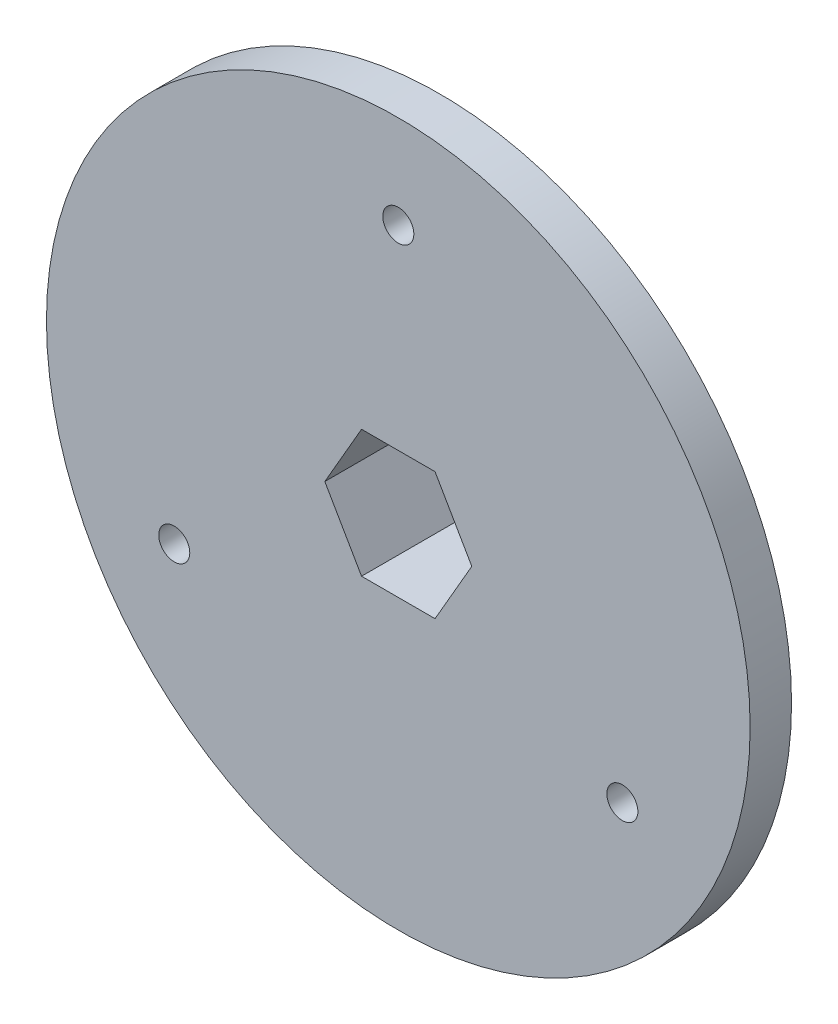
ISO-10303-21;
HEADER;
FILE_DESCRIPTION(('STEP AP214'),'2;1');
FILE_NAME('part.step','',(''),(''),'','','');
FILE_SCHEMA(('AUTOMOTIVE_DESIGN { 1 0 10303 214 1 1 1 1 }'));
ENDSEC;
DATA;
#1=APPLICATION_CONTEXT('core data for automotive mechanical design processes');
#2=APPLICATION_PROTOCOL_DEFINITION('international standard','automotive_design',2000,#1);
#3=PRODUCT_CONTEXT('',#1,'mechanical');
#4=PRODUCT('Part','Part','',(#3));
#5=PRODUCT_RELATED_PRODUCT_CATEGORY('part','',(#4));
#6=PRODUCT_DEFINITION_FORMATION('','',#4);
#7=PRODUCT_DEFINITION_CONTEXT('part definition',#1,'design');
#8=PRODUCT_DEFINITION('design','',#6,#7);
#9=PRODUCT_DEFINITION_SHAPE('','',#8);
#10=(LENGTH_UNIT() NAMED_UNIT(*) SI_UNIT(.MILLI.,.METRE.));
#11=(NAMED_UNIT(*) PLANE_ANGLE_UNIT() SI_UNIT($,.RADIAN.));
#12=(NAMED_UNIT(*) SI_UNIT($,.STERADIAN.) SOLID_ANGLE_UNIT());
#13=UNCERTAINTY_MEASURE_WITH_UNIT(LENGTH_MEASURE(1.E-05),#10,'distance_accuracy_value','');
#14=(GEOMETRIC_REPRESENTATION_CONTEXT(3) GLOBAL_UNCERTAINTY_ASSIGNED_CONTEXT((#13)) GLOBAL_UNIT_ASSIGNED_CONTEXT((#10,
#11,#12)) REPRESENTATION_CONTEXT('',''));
#15=CARTESIAN_POINT('',(0.,0.,0.));
#16=DIRECTION('',(0.,0.,1.));
#17=DIRECTION('',(1.,0.,0.));
#18=AXIS2_PLACEMENT_3D('',#15,#16,#17);
#19=CARTESIAN_POINT('',(0.,0.,0.));
#20=DIRECTION('',(0.,0.,1.));
#21=DIRECTION('',(1.,0.,0.));
#22=AXIS2_PLACEMENT_3D('',#19,#20,#21);
#23=PLANE('',#22);
#24=CARTESIAN_POINT('',(-21.650635094611,-12.5,0.));
#25=DIRECTION('',(0.,0.,1.));
#26=DIRECTION('',(1.,0.,0.));
#27=AXIS2_PLACEMENT_3D('',#24,#25,#26);
#28=CIRCLE('',#27,1.5);
#29=CARTESIAN_POINT('',(-20.150635094611,-12.5,0.));
#30=VERTEX_POINT('',#29);
#31=EDGE_CURVE('E162',#30,#30,#28,.T.);
#32=ORIENTED_EDGE('',*,*,#31,.T.);
#33=EDGE_LOOP('',(#32));
#34=FACE_BOUND('',#33,.T.);
#35=CARTESIAN_POINT('',(21.650635094611,-12.5,0.));
#36=DIRECTION('',(0.,0.,1.));
#37=DIRECTION('',(1.,0.,0.));
#38=AXIS2_PLACEMENT_3D('',#35,#36,#37);
#39=CIRCLE('',#38,1.50000000000004);
#40=CARTESIAN_POINT('',(23.150635094611,-12.5,0.));
#41=VERTEX_POINT('',#40);
#42=EDGE_CURVE('E177',#41,#41,#39,.T.);
#43=ORIENTED_EDGE('',*,*,#42,.T.);
#44=EDGE_LOOP('',(#43));
#45=FACE_BOUND('',#44,.T.);
#46=CARTESIAN_POINT('',(0.,25.,0.));
#47=DIRECTION('',(0.,0.,1.));
#48=DIRECTION('',(1.,0.,0.));
#49=AXIS2_PLACEMENT_3D('',#46,#47,#48);
#50=CIRCLE('',#49,1.5);
#51=CARTESIAN_POINT('',(1.5,25.,0.));
#52=VERTEX_POINT('',#51);
#53=EDGE_CURVE('E185',#52,#52,#50,.T.);
#54=ORIENTED_EDGE('',*,*,#53,.T.);
#55=EDGE_LOOP('',(#54));
#56=FACE_BOUND('',#55,.T.);
#57=CARTESIAN_POINT('',(0.,0.,0.));
#58=DIRECTION('',(0.,0.,1.));
#59=DIRECTION('',(1.,0.,0.));
#60=AXIS2_PLACEMENT_3D('',#57,#58,#59);
#61=CIRCLE('',#60,34.);
#62=CARTESIAN_POINT('',(34.,0.,0.));
#63=VERTEX_POINT('',#62);
#64=EDGE_CURVE('E193',#63,#63,#61,.T.);
#65=ORIENTED_EDGE('',*,*,#64,.F.);
#66=EDGE_LOOP('',(#65));
#67=FACE_BOUND('',#66,.T.);
#68=CARTESIAN_POINT('',(0.,0.,0.));
#69=DIRECTION('',(0.,0.,1.));
#70=DIRECTION('',(1.,0.,0.));
#71=AXIS2_PLACEMENT_3D('',#68,#69,#70);
#72=CIRCLE('',#71,16.9622689297226);
#73=CARTESIAN_POINT('',(16.9622689297226,0.,0.));
#74=VERTEX_POINT('',#73);
#75=EDGE_CURVE('E11',#74,#74,#72,.F.);
#76=ORIENTED_EDGE('',*,*,#75,.F.);
#77=EDGE_LOOP('',(#76));
#78=FACE_BOUND('',#77,.T.);
#79=ADVANCED_FACE('F41',(#34,#45,#56,#67,#78),#23,.F.);
#80=CARTESIAN_POINT('',(0.,0.,4.));
#81=DIRECTION('',(0.,0.,1.));
#82=DIRECTION('',(1.,0.,0.));
#83=AXIS2_PLACEMENT_3D('',#80,#81,#82);
#84=PLANE('',#83);
#85=DIRECTION('',(0.5,0.866025403784438,0.));
#86=VECTOR('',#85,1.);
#87=CARTESIAN_POINT('',(-7.1014083110324,0.,4.));
#88=LINE('',#87,#86);
#89=CARTESIAN_POINT('',(-7.1014083110324,0.,4.));
#90=VERTEX_POINT('',#89);
#91=CARTESIAN_POINT('',(-3.5507041555162,6.15,4.));
#92=VERTEX_POINT('',#91);
#93=EDGE_CURVE('E139',#90,#92,#88,.T.);
#94=ORIENTED_EDGE('',*,*,#93,.T.);
#95=DIRECTION('',(1.,0.,0.));
#96=VECTOR('',#95,1.);
#97=CARTESIAN_POINT('',(-3.5507041555162,6.15,4.));
#98=LINE('',#97,#96);
#99=CARTESIAN_POINT('',(3.5507041555162,6.15,4.));
#100=VERTEX_POINT('',#99);
#101=EDGE_CURVE('E143',#92,#100,#98,.T.);
#102=ORIENTED_EDGE('',*,*,#101,.T.);
#103=DIRECTION('',(0.5,-0.866025403784439,0.));
#104=VECTOR('',#103,1.);
#105=CARTESIAN_POINT('',(3.5507041555162,6.15,4.));
#106=LINE('',#105,#104);
#107=CARTESIAN_POINT('',(7.1014083110324,0.,4.));
#108=VERTEX_POINT('',#107);
#109=EDGE_CURVE('E57',#100,#108,#106,.T.);
#110=ORIENTED_EDGE('',*,*,#109,.T.);
#111=DIRECTION('',(-0.5,-0.866025403784438,0.));
#112=VECTOR('',#111,1.);
#113=CARTESIAN_POINT('',(7.1014083110324,0.,4.));
#114=LINE('',#113,#112);
#115=CARTESIAN_POINT('',(3.5507041555162,-6.15,4.));
#116=VERTEX_POINT('',#115);
#117=EDGE_CURVE('E148',#108,#116,#114,.T.);
#118=ORIENTED_EDGE('',*,*,#117,.T.);
#119=DIRECTION('',(-1.,0.,0.));
#120=VECTOR('',#119,1.);
#121=CARTESIAN_POINT('',(3.5507041555162,-6.15,4.));
#122=LINE('',#121,#120);
#123=CARTESIAN_POINT('',(-3.5507041555162,-6.15,4.));
#124=VERTEX_POINT('',#123);
#125=EDGE_CURVE('E152',#116,#124,#122,.T.);
#126=ORIENTED_EDGE('',*,*,#125,.T.);
#127=DIRECTION('',(-0.5,0.866025403784439,0.));
#128=VECTOR('',#127,1.);
#129=CARTESIAN_POINT('',(-3.5507041555162,-6.15,4.));
#130=LINE('',#129,#128);
#131=EDGE_CURVE('E156',#124,#90,#130,.T.);
#132=ORIENTED_EDGE('',*,*,#131,.T.);
#133=EDGE_LOOP('',(#94,#102,#110,#118,#126,#132));
#134=FACE_BOUND('',#133,.T.);
#135=CARTESIAN_POINT('',(21.650635094611,-12.5,4.));
#136=DIRECTION('',(0.,0.,1.));
#137=DIRECTION('',(1.,0.,0.));
#138=AXIS2_PLACEMENT_3D('',#135,#136,#137);
#139=CIRCLE('',#138,1.50000000000004);
#140=CARTESIAN_POINT('',(23.150635094611,-12.5,4.));
#141=VERTEX_POINT('',#140);
#142=EDGE_CURVE('E181',#141,#141,#139,.T.);
#143=ORIENTED_EDGE('',*,*,#142,.F.);
#144=EDGE_LOOP('',(#143));
#145=FACE_BOUND('',#144,.T.);
#146=CARTESIAN_POINT('',(0.,0.,4.));
#147=DIRECTION('',(0.,0.,1.));
#148=DIRECTION('',(1.,0.,0.));
#149=AXIS2_PLACEMENT_3D('',#146,#147,#148);
#150=CIRCLE('',#149,34.);
#151=CARTESIAN_POINT('',(34.,0.,4.));
#152=VERTEX_POINT('',#151);
#153=EDGE_CURVE('E50',#152,#152,#150,.T.);
#154=ORIENTED_EDGE('',*,*,#153,.T.);
#155=EDGE_LOOP('',(#154));
#156=FACE_BOUND('',#155,.T.);
#157=CARTESIAN_POINT('',(0.,25.,4.));
#158=DIRECTION('',(0.,0.,1.));
#159=DIRECTION('',(1.,0.,0.));
#160=AXIS2_PLACEMENT_3D('',#157,#158,#159);
#161=CIRCLE('',#160,1.5);
#162=CARTESIAN_POINT('',(1.5,25.,4.));
#163=VERTEX_POINT('',#162);
#164=EDGE_CURVE('E189',#163,#163,#161,.T.);
#165=ORIENTED_EDGE('',*,*,#164,.F.);
#166=EDGE_LOOP('',(#165));
#167=FACE_BOUND('',#166,.T.);
#168=CARTESIAN_POINT('',(-21.650635094611,-12.5,4.));
#169=DIRECTION('',(0.,0.,1.));
#170=DIRECTION('',(1.,0.,0.));
#171=AXIS2_PLACEMENT_3D('',#168,#169,#170);
#172=CIRCLE('',#171,1.5);
#173=CARTESIAN_POINT('',(-20.150635094611,-12.5,4.));
#174=VERTEX_POINT('',#173);
#175=EDGE_CURVE('E173',#174,#174,#172,.T.);
#176=ORIENTED_EDGE('',*,*,#175,.F.);
#177=EDGE_LOOP('',(#176));
#178=FACE_BOUND('',#177,.T.);
#179=ADVANCED_FACE('F206',(#134,#145,#156,#167,#178),#84,.T.);
#180=CARTESIAN_POINT('',(0.,0.,4.));
#181=DIRECTION('',(0.,0.,-1.));
#182=DIRECTION('',(-1.,0.,0.));
#183=AXIS2_PLACEMENT_3D('',#180,#181,#182);
#184=CYLINDRICAL_SURFACE('',#183,34.);
#185=ORIENTED_EDGE('',*,*,#153,.F.);
#186=EDGE_LOOP('',(#185));
#187=FACE_BOUND('',#186,.T.);
#188=ORIENTED_EDGE('',*,*,#64,.T.);
#189=EDGE_LOOP('',(#188));
#190=FACE_BOUND('',#189,.T.);
#191=ADVANCED_FACE('F43',(#187,#190),#184,.T.);
#192=CARTESIAN_POINT('',(0.,25.,4.));
#193=DIRECTION('',(0.,0.,-1.));
#194=DIRECTION('',(-1.,0.,0.));
#195=AXIS2_PLACEMENT_3D('',#192,#193,#194);
#196=CYLINDRICAL_SURFACE('',#195,1.5);
#197=ORIENTED_EDGE('',*,*,#164,.T.);
#198=EDGE_LOOP('',(#197));
#199=FACE_BOUND('',#198,.T.);
#200=ORIENTED_EDGE('',*,*,#53,.F.);
#201=EDGE_LOOP('',(#200));
#202=FACE_BOUND('',#201,.T.);
#203=ADVANCED_FACE('F246',(#199,#202),#196,.F.);
#204=CARTESIAN_POINT('',(21.650635094611,-12.5,4.));
#205=DIRECTION('',(0.,0.,-1.));
#206=DIRECTION('',(-1.,0.,0.));
#207=AXIS2_PLACEMENT_3D('',#204,#205,#206);
#208=CYLINDRICAL_SURFACE('',#207,1.50000000000004);
#209=ORIENTED_EDGE('',*,*,#142,.T.);
#210=EDGE_LOOP('',(#209));
#211=FACE_BOUND('',#210,.T.);
#212=ORIENTED_EDGE('',*,*,#42,.F.);
#213=EDGE_LOOP('',(#212));
#214=FACE_BOUND('',#213,.T.);
#215=ADVANCED_FACE('F242',(#211,#214),#208,.F.);
#216=CARTESIAN_POINT('',(-21.650635094611,-12.5,4.));
#217=DIRECTION('',(0.,0.,-1.));
#218=DIRECTION('',(-1.,0.,0.));
#219=AXIS2_PLACEMENT_3D('',#216,#217,#218);
#220=CYLINDRICAL_SURFACE('',#219,1.5);
#221=ORIENTED_EDGE('',*,*,#175,.T.);
#222=EDGE_LOOP('',(#221));
#223=FACE_BOUND('',#222,.T.);
#224=ORIENTED_EDGE('',*,*,#31,.F.);
#225=EDGE_LOOP('',(#224));
#226=FACE_BOUND('',#225,.T.);
#227=ADVANCED_FACE('F238',(#223,#226),#220,.F.);
#228=CARTESIAN_POINT('',(-7.1014083110324,0.,4.));
#229=DIRECTION('',(-0.866025403784439,0.5,0.));
#230=DIRECTION('',(-0.5,-0.866025403784438,0.));
#231=AXIS2_PLACEMENT_3D('',#228,#229,#230);
#232=PLANE('',#231);
#233=DIRECTION('',(0.,0.,-1.));
#234=VECTOR('',#233,1.);
#235=CARTESIAN_POINT('',(-7.1014083110324,0.,4.));
#236=LINE('',#235,#234);
#237=CARTESIAN_POINT('',(-7.1014083110324,0.,-6.));
#238=VERTEX_POINT('',#237);
#239=EDGE_CURVE('E65',#90,#238,#236,.T.);
#240=ORIENTED_EDGE('',*,*,#239,.T.);
#241=DIRECTION('',(-0.5,-0.866025403784439,0.));
#242=VECTOR('',#241,1.);
#243=CARTESIAN_POINT('',(-5.3260562332743,3.075,-6.));
#244=LINE('',#243,#242);
#245=CARTESIAN_POINT('',(-3.5507041555162,6.15,-6.));
#246=VERTEX_POINT('',#245);
#247=EDGE_CURVE('E113',#246,#238,#244,.T.);
#248=ORIENTED_EDGE('',*,*,#247,.F.);
#249=DIRECTION('',(0.,0.,-1.));
#250=VECTOR('',#249,1.);
#251=CARTESIAN_POINT('',(-3.5507041555162,6.15,4.));
#252=LINE('',#251,#250);
#253=EDGE_CURVE('E104',#92,#246,#252,.T.);
#254=ORIENTED_EDGE('',*,*,#253,.F.);
#255=ORIENTED_EDGE('',*,*,#93,.F.);
#256=EDGE_LOOP('',(#240,#248,#254,#255));
#257=FACE_BOUND('',#256,.T.);
#258=ADVANCED_FACE('F224',(#257),#232,.F.);
#259=CARTESIAN_POINT('',(-3.5507041555162,-6.15,4.));
#260=DIRECTION('',(-0.866025403784439,-0.5,0.));
#261=DIRECTION('',(0.5,-0.866025403784439,0.));
#262=AXIS2_PLACEMENT_3D('',#259,#260,#261);
#263=PLANE('',#262);
#264=DIRECTION('',(0.,0.,-1.));
#265=VECTOR('',#264,1.);
#266=CARTESIAN_POINT('',(-3.5507041555162,-6.15,4.));
#267=LINE('',#266,#265);
#268=CARTESIAN_POINT('',(-3.5507041555162,-6.15,-6.));
#269=VERTEX_POINT('',#268);
#270=EDGE_CURVE('E163',#124,#269,#267,.T.);
#271=ORIENTED_EDGE('',*,*,#270,.T.);
#272=DIRECTION('',(0.5,-0.866025403784439,0.));
#273=VECTOR('',#272,1.);
#274=CARTESIAN_POINT('',(-5.3260562332743,-3.075,-6.));
#275=LINE('',#274,#273);
#276=EDGE_CURVE('E130',#238,#269,#275,.T.);
#277=ORIENTED_EDGE('',*,*,#276,.F.);
#278=ORIENTED_EDGE('',*,*,#239,.F.);
#279=ORIENTED_EDGE('',*,*,#131,.F.);
#280=EDGE_LOOP('',(#271,#277,#278,#279));
#281=FACE_BOUND('',#280,.T.);
#282=ADVANCED_FACE('F220',(#281),#263,.F.);
#283=CARTESIAN_POINT('',(3.5507041555162,-6.15,4.));
#284=DIRECTION('',(0.,-1.,0.));
#285=DIRECTION('',(0.,0.,-1.));
#286=AXIS2_PLACEMENT_3D('',#283,#284,#285);
#287=PLANE('',#286);
#288=DIRECTION('',(0.,0.,-1.));
#289=VECTOR('',#288,1.);
#290=CARTESIAN_POINT('',(3.5507041555162,-6.15,4.));
#291=LINE('',#290,#289);
#292=CARTESIAN_POINT('',(3.5507041555162,-6.15,-6.));
#293=VERTEX_POINT('',#292);
#294=EDGE_CURVE('E166',#116,#293,#291,.T.);
#295=ORIENTED_EDGE('',*,*,#294,.T.);
#296=DIRECTION('',(1.,0.,0.));
#297=VECTOR('',#296,1.);
#298=CARTESIAN_POINT('',(0.,-6.15,-6.));
#299=LINE('',#298,#297);
#300=EDGE_CURVE('E134',#269,#293,#299,.T.);
#301=ORIENTED_EDGE('',*,*,#300,.F.);
#302=ORIENTED_EDGE('',*,*,#270,.F.);
#303=ORIENTED_EDGE('',*,*,#125,.F.);
#304=EDGE_LOOP('',(#295,#301,#302,#303));
#305=FACE_BOUND('',#304,.T.);
#306=ADVANCED_FACE('F223',(#305),#287,.F.);
#307=CARTESIAN_POINT('',(7.1014083110324,0.,4.));
#308=DIRECTION('',(0.866025403784438,-0.5,0.));
#309=DIRECTION('',(0.5,0.866025403784439,0.));
#310=AXIS2_PLACEMENT_3D('',#307,#308,#309);
#311=PLANE('',#310);
#312=DIRECTION('',(0.,0.,-1.));
#313=VECTOR('',#312,1.);
#314=CARTESIAN_POINT('',(7.1014083110324,0.,4.));
#315=LINE('',#314,#313);
#316=CARTESIAN_POINT('',(7.1014083110324,0.,-6.));
#317=VERTEX_POINT('',#316);
#318=EDGE_CURVE('E103',#108,#317,#315,.T.);
#319=ORIENTED_EDGE('',*,*,#318,.T.);
#320=DIRECTION('',(0.5,0.866025403784439,0.));
#321=VECTOR('',#320,1.);
#322=CARTESIAN_POINT('',(5.3260562332743,-3.075,-6.));
#323=LINE('',#322,#321);
#324=EDGE_CURVE('E120',#293,#317,#323,.T.);
#325=ORIENTED_EDGE('',*,*,#324,.F.);
#326=ORIENTED_EDGE('',*,*,#294,.F.);
#327=ORIENTED_EDGE('',*,*,#117,.F.);
#328=EDGE_LOOP('',(#319,#325,#326,#327));
#329=FACE_BOUND('',#328,.T.);
#330=ADVANCED_FACE('F227',(#329),#311,.F.);
#331=CARTESIAN_POINT('',(3.5507041555162,6.15,4.));
#332=DIRECTION('',(0.866025403784439,0.5,0.));
#333=DIRECTION('',(-0.5,0.866025403784439,0.));
#334=AXIS2_PLACEMENT_3D('',#331,#332,#333);
#335=PLANE('',#334);
#336=DIRECTION('',(0.,0.,-1.));
#337=VECTOR('',#336,1.);
#338=CARTESIAN_POINT('',(3.5507041555162,6.15,4.));
#339=LINE('',#338,#337);
#340=CARTESIAN_POINT('',(3.5507041555162,6.15,-6.));
#341=VERTEX_POINT('',#340);
#342=EDGE_CURVE('E94',#100,#341,#339,.T.);
#343=ORIENTED_EDGE('',*,*,#342,.T.);
#344=DIRECTION('',(-0.5,0.866025403784439,0.));
#345=VECTOR('',#344,1.);
#346=CARTESIAN_POINT('',(5.3260562332743,3.075,-6.));
#347=LINE('',#346,#345);
#348=EDGE_CURVE('E98',#317,#341,#347,.T.);
#349=ORIENTED_EDGE('',*,*,#348,.F.);
#350=ORIENTED_EDGE('',*,*,#318,.F.);
#351=ORIENTED_EDGE('',*,*,#109,.F.);
#352=EDGE_LOOP('',(#343,#349,#350,#351));
#353=FACE_BOUND('',#352,.T.);
#354=ADVANCED_FACE('F96',(#353),#335,.F.);
#355=CARTESIAN_POINT('',(-3.5507041555162,6.15,4.));
#356=DIRECTION('',(0.,1.,0.));
#357=DIRECTION('',(0.,0.,1.));
#358=AXIS2_PLACEMENT_3D('',#355,#356,#357);
#359=PLANE('',#358);
#360=ORIENTED_EDGE('',*,*,#253,.T.);
#361=DIRECTION('',(-1.,0.,0.));
#362=VECTOR('',#361,1.);
#363=CARTESIAN_POINT('',(0.,6.15,-6.));
#364=LINE('',#363,#362);
#365=EDGE_CURVE('E107',#341,#246,#364,.T.);
#366=ORIENTED_EDGE('',*,*,#365,.F.);
#367=ORIENTED_EDGE('',*,*,#342,.F.);
#368=ORIENTED_EDGE('',*,*,#101,.F.);
#369=EDGE_LOOP('',(#360,#366,#367,#368));
#370=FACE_BOUND('',#369,.T.);
#371=ADVANCED_FACE('F108',(#370),#359,.F.);
#372=CARTESIAN_POINT('',(0.,0.,-6.));
#373=DIRECTION('',(0.,0.,-1.));
#374=DIRECTION('',(-1.,0.,0.));
#375=AXIS2_PLACEMENT_3D('',#372,#373,#374);
#376=PLANE('',#375);
#377=ORIENTED_EDGE('',*,*,#348,.T.);
#378=ORIENTED_EDGE('',*,*,#365,.T.);
#379=ORIENTED_EDGE('',*,*,#247,.T.);
#380=ORIENTED_EDGE('',*,*,#276,.T.);
#381=ORIENTED_EDGE('',*,*,#300,.T.);
#382=ORIENTED_EDGE('',*,*,#324,.T.);
#383=EDGE_LOOP('',(#377,#378,#379,#380,#381,#382));
#384=FACE_BOUND('',#383,.T.);
#385=CARTESIAN_POINT('',(0.,0.,-6.));
#386=DIRECTION('',(0.,0.,-1.));
#387=DIRECTION('',(-1.,0.,0.));
#388=AXIS2_PLACEMENT_3D('',#385,#386,#387);
#389=CIRCLE('',#388,9.);
#390=CARTESIAN_POINT('',(-9.,0.,-6.));
#391=VERTEX_POINT('',#390);
#392=EDGE_CURVE('E122',#391,#391,#389,.T.);
#393=ORIENTED_EDGE('',*,*,#392,.T.);
#394=EDGE_LOOP('',(#393));
#395=FACE_BOUND('',#394,.T.);
#396=ADVANCED_FACE('F116',(#384,#395),#376,.T.);
#397=CARTESIAN_POINT('',(0.,0.,0.));
#398=DIRECTION('',(0.,0.,1.));
#399=DIRECTION('',(1.,0.,0.));
#400=AXIS2_PLACEMENT_3D('',#397,#398,#399);
#401=CONICAL_SURFACE('',#400,16.9622689297226,0.925024503557001);
#402=ORIENTED_EDGE('',*,*,#392,.F.);
#403=EDGE_LOOP('',(#402));
#404=FACE_BOUND('',#403,.T.);
#405=ORIENTED_EDGE('',*,*,#75,.T.);
#406=EDGE_LOOP('',(#405));
#407=FACE_BOUND('',#406,.T.);
#408=ADVANCED_FACE('F210',(#404,#407),#401,.T.);
#409=CLOSED_SHELL('',(#79,#179,#191,#203,#215,#227,#258,#282,#306,#330,#354,#371,#396,#408));
#410=MANIFOLD_SOLID_BREP('B2',#409);
#411=ADVANCED_BREP_SHAPE_REPRESENTATION('',(#18,#410),#14);
#412=SHAPE_DEFINITION_REPRESENTATION(#9,#411);
ENDSEC;
END-ISO-10303-21;
